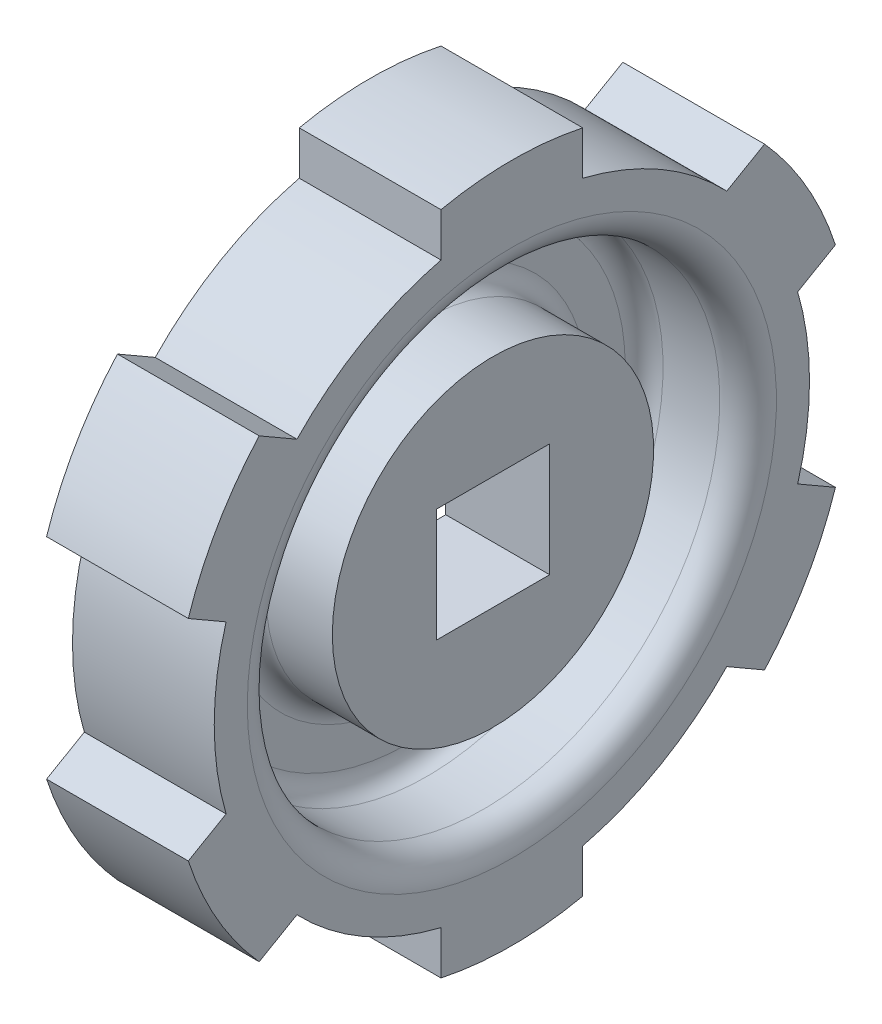
ISO-10303-21;
HEADER;
FILE_DESCRIPTION(('STEP AP214'),'2;1');
FILE_NAME('part.step','',(''),(''),'','','');
FILE_SCHEMA(('AUTOMOTIVE_DESIGN { 1 0 10303 214 1 1 1 1 }'));
ENDSEC;
DATA;
#1=APPLICATION_CONTEXT('core data for automotive mechanical design processes');
#2=APPLICATION_PROTOCOL_DEFINITION('international standard','automotive_design',2000,#1);
#3=PRODUCT_CONTEXT('',#1,'mechanical');
#4=PRODUCT('Part','Part','',(#3));
#5=PRODUCT_RELATED_PRODUCT_CATEGORY('part','',(#4));
#6=PRODUCT_DEFINITION_FORMATION('','',#4);
#7=PRODUCT_DEFINITION_CONTEXT('part definition',#1,'design');
#8=PRODUCT_DEFINITION('design','',#6,#7);
#9=PRODUCT_DEFINITION_SHAPE('','',#8);
#10=(LENGTH_UNIT() NAMED_UNIT(*) SI_UNIT(.MILLI.,.METRE.));
#11=(NAMED_UNIT(*) PLANE_ANGLE_UNIT() SI_UNIT($,.RADIAN.));
#12=(NAMED_UNIT(*) SI_UNIT($,.STERADIAN.) SOLID_ANGLE_UNIT());
#13=UNCERTAINTY_MEASURE_WITH_UNIT(LENGTH_MEASURE(1.E-05),#10,'distance_accuracy_value','');
#14=(GEOMETRIC_REPRESENTATION_CONTEXT(3) GLOBAL_UNCERTAINTY_ASSIGNED_CONTEXT((#13)) GLOBAL_UNIT_ASSIGNED_CONTEXT((#10,
#11,#12)) REPRESENTATION_CONTEXT('',''));
#15=CARTESIAN_POINT('',(0.,0.,0.));
#16=DIRECTION('',(0.,0.,1.));
#17=DIRECTION('',(1.,0.,0.));
#18=AXIS2_PLACEMENT_3D('',#15,#16,#17);
#19=CARTESIAN_POINT('',(0.,0.,0.));
#20=DIRECTION('',(-1.,0.,0.));
#21=DIRECTION('',(0.,0.,1.00000000000004));
#22=AXIS2_PLACEMENT_3D('',#19,#20,#21);
#23=CYLINDRICAL_SURFACE('',#22,31.5);
#24=CARTESIAN_POINT('',(15.,0.,0.));
#25=DIRECTION('',(-1.,0.,0.));
#26=DIRECTION('',(0.,0.,1.00000000000004));
#27=AXIS2_PLACEMENT_3D('',#24,#25,#26);
#28=CIRCLE('',#27,31.5);
#29=CARTESIAN_POINT('',(15.,21.7922490691625,22.7452825989839));
#30=VERTEX_POINT('',#29);
#31=CARTESIAN_POINT('',(15.,30.5941170815579,7.50000000000032));
#32=VERTEX_POINT('',#31);
#33=EDGE_CURVE('E309',#30,#32,#28,.T.);
#34=ORIENTED_EDGE('',*,*,#33,.T.);
#35=DIRECTION('',(-1.,0.,0.));
#36=VECTOR('',#35,1.);
#37=CARTESIAN_POINT('',(30.9443899264888,30.5941170815579,7.50000000000032));
#38=LINE('',#37,#36);
#39=CARTESIAN_POINT('',(0.,30.5941170815579,7.50000000000031));
#40=VERTEX_POINT('',#39);
#41=EDGE_CURVE('E268',#32,#40,#38,.T.);
#42=ORIENTED_EDGE('',*,*,#41,.T.);
#43=CARTESIAN_POINT('',(0.,0.,0.));
#44=DIRECTION('',(-1.,0.,0.));
#45=DIRECTION('',(0.,0.,1.00000000000004));
#46=AXIS2_PLACEMENT_3D('',#43,#44,#45);
#47=CIRCLE('',#46,31.5);
#48=CARTESIAN_POINT('',(0.,21.7922490691625,22.7452825989836));
#49=VERTEX_POINT('',#48);
#50=EDGE_CURVE('E258',#49,#40,#47,.T.);
#51=ORIENTED_EDGE('',*,*,#50,.F.);
#52=DIRECTION('',(-1.,0.,0.));
#53=VECTOR('',#52,1.);
#54=CARTESIAN_POINT('',(30.9443899264888,21.7922490691625,22.7452825989839));
#55=LINE('',#54,#53);
#56=EDGE_CURVE('E459',#30,#49,#55,.T.);
#57=ORIENTED_EDGE('',*,*,#56,.F.);
#58=EDGE_LOOP('',(#34,#42,#51,#57));
#59=FACE_BOUND('',#58,.T.);
#60=ADVANCED_FACE('F53',(#59),#23,.T.);
#61=CARTESIAN_POINT('',(30.9443899264888,-6.49519052838355,3.75000000000019));
#62=DIRECTION('',(0.,0.866025403784472,-0.50000000000003));
#63=DIRECTION('',(-1.,0.,0.));
#64=AXIS2_PLACEMENT_3D('',#61,#62,#63);
#65=PLANE('',#64);
#66=DIRECTION('',(-1.,0.,0.));
#67=VECTOR('',#66,1.);
#68=CARTESIAN_POINT('',(30.9443899264888,8.80186801239571,30.2452825989847));
#69=LINE('',#68,#67);
#70=CARTESIAN_POINT('',(15.,8.80186801239556,30.2452825989844));
#71=VERTEX_POINT('',#70);
#72=CARTESIAN_POINT('',(0.,8.80186801239573,30.2452825989844));
#73=VERTEX_POINT('',#72);
#74=EDGE_CURVE('E464',#71,#73,#69,.T.);
#75=ORIENTED_EDGE('',*,*,#74,.F.);
#76=DIRECTION('',(0.,0.50000000000003,0.866025403784472));
#77=VECTOR('',#76,1.);
#78=CARTESIAN_POINT('',(15.,-6.49519052838348,3.75000000000023));
#79=LINE('',#78,#77);
#80=CARTESIAN_POINT('',(15.,11.1098513630755,34.2428270253852));
#81=VERTEX_POINT('',#80);
#82=EDGE_CURVE('E466',#71,#81,#79,.T.);
#83=ORIENTED_EDGE('',*,*,#82,.T.);
#84=DIRECTION('',(-1.,0.,0.));
#85=VECTOR('',#84,1.);
#86=CARTESIAN_POINT('',(30.9443899264888,11.1098513630757,34.2428270253852));
#87=LINE('',#86,#85);
#88=CARTESIAN_POINT('',(0.,11.1098513630757,34.2428270253852));
#89=VERTEX_POINT('',#88);
#90=EDGE_CURVE('E453',#81,#89,#87,.T.);
#91=ORIENTED_EDGE('',*,*,#90,.T.);
#92=DIRECTION('',(0.,-0.50000000000003,-0.866025403784472));
#93=VECTOR('',#92,1.);
#94=CARTESIAN_POINT('',(0.,-6.49519052838355,3.75000000000023));
#95=LINE('',#94,#93);
#96=EDGE_CURVE('E469',#89,#73,#95,.T.);
#97=ORIENTED_EDGE('',*,*,#96,.T.);
#98=EDGE_LOOP('',(#75,#83,#91,#97));
#99=FACE_BOUND('',#98,.T.);
#100=ADVANCED_FACE('F516',(#99),#65,.F.);
#101=CARTESIAN_POINT('',(30.9443899264888,6.49519052838355,-3.75000000000027));
#102=DIRECTION('',(0.,0.866025403784472,-0.50000000000003));
#103=DIRECTION('',(-1.,0.,0.));
#104=AXIS2_PLACEMENT_3D('',#101,#102,#103);
#105=PLANE('',#104);
#106=DIRECTION('',(0.,0.50000000000003,0.866025403784472));
#107=VECTOR('',#106,1.);
#108=CARTESIAN_POINT('',(15.,6.49519052838363,-3.75000000000027));
#109=LINE('',#108,#107);
#110=CARTESIAN_POINT('',(15.,24.1002324198431,26.7428270253852));
#111=VERTEX_POINT('',#110);
#112=EDGE_CURVE('E456',#30,#111,#109,.T.);
#113=ORIENTED_EDGE('',*,*,#112,.F.);
#114=ORIENTED_EDGE('',*,*,#56,.T.);
#115=DIRECTION('',(0.,-0.50000000000003,-0.866025403784472));
#116=VECTOR('',#115,1.);
#117=CARTESIAN_POINT('',(0.,6.49519052838355,-3.75000000000023));
#118=LINE('',#117,#116);
#119=CARTESIAN_POINT('',(0.,24.1002324198431,26.7428270253849));
#120=VERTEX_POINT('',#119);
#121=EDGE_CURVE('E462',#120,#49,#118,.T.);
#122=ORIENTED_EDGE('',*,*,#121,.F.);
#123=DIRECTION('',(-1.,0.,0.));
#124=VECTOR('',#123,1.);
#125=CARTESIAN_POINT('',(30.9443899264888,24.1002324198431,26.7428270253852));
#126=LINE('',#125,#124);
#127=EDGE_CURVE('E448',#111,#120,#126,.T.);
#128=ORIENTED_EDGE('',*,*,#127,.F.);
#129=EDGE_LOOP('',(#113,#114,#122,#128));
#130=FACE_BOUND('',#129,.T.);
#131=ADVANCED_FACE('F524',(#130),#105,.T.);
#132=CARTESIAN_POINT('',(30.9443899264888,0.,0.));
#133=DIRECTION('',(-1.,0.,0.));
#134=DIRECTION('',(0.,-0.866025403784472,0.50000000000003));
#135=AXIS2_PLACEMENT_3D('',#132,#133,#134);
#136=CYLINDRICAL_SURFACE('',#135,36.);
#137=CARTESIAN_POINT('',(15.,0.,0.));
#138=DIRECTION('',(-1.,0.,0.));
#139=DIRECTION('',(0.,-0.866025403784472,0.50000000000003));
#140=AXIS2_PLACEMENT_3D('',#137,#138,#139);
#141=CIRCLE('',#140,36.);
#142=EDGE_CURVE('E446',#111,#81,#141,.F.);
#143=ORIENTED_EDGE('',*,*,#142,.F.);
#144=ORIENTED_EDGE('',*,*,#127,.T.);
#145=CARTESIAN_POINT('',(0.,0.,0.));
#146=DIRECTION('',(-1.,0.,0.));
#147=DIRECTION('',(0.,-0.866025403784472,0.50000000000003));
#148=AXIS2_PLACEMENT_3D('',#145,#146,#147);
#149=CIRCLE('',#148,36.);
#150=EDGE_CURVE('E450',#89,#120,#149,.T.);
#151=ORIENTED_EDGE('',*,*,#150,.F.);
#152=ORIENTED_EDGE('',*,*,#90,.F.);
#153=EDGE_LOOP('',(#143,#144,#151,#152));
#154=FACE_BOUND('',#153,.T.);
#155=ADVANCED_FACE('F530',(#154),#136,.T.);
#156=CARTESIAN_POINT('',(15.,-8.80186801239525,30.2452825989849));
#157=VERTEX_POINT('',#156);
#158=EDGE_CURVE('E75',#157,#71,#28,.T.);
#159=ORIENTED_EDGE('',*,*,#158,.T.);
#160=ORIENTED_EDGE('',*,*,#74,.T.);
#161=CARTESIAN_POINT('',(0.,-8.80186801239509,30.2452825989849));
#162=VERTEX_POINT('',#161);
#163=EDGE_CURVE('E68',#162,#73,#47,.T.);
#164=ORIENTED_EDGE('',*,*,#163,.F.);
#165=DIRECTION('',(-1.,0.,0.));
#166=VECTOR('',#165,1.);
#167=CARTESIAN_POINT('',(30.9443899264888,-8.80186801239509,30.2452825989846));
#168=LINE('',#167,#166);
#169=EDGE_CURVE('E432',#157,#162,#168,.T.);
#170=ORIENTED_EDGE('',*,*,#169,.F.);
#171=EDGE_LOOP('',(#159,#160,#164,#170));
#172=FACE_BOUND('',#171,.T.);
#173=ADVANCED_FACE('F519',(#172),#23,.T.);
#174=CARTESIAN_POINT('',(30.9443899264888,-6.49519052838363,-3.75000000000014));
#175=DIRECTION('',(0.,0.866025403784483,0.500000000000012));
#176=DIRECTION('',(-1.,0.,0.));
#177=AXIS2_PLACEMENT_3D('',#174,#175,#176);
#178=PLANE('',#177);
#179=DIRECTION('',(-1.,0.,0.));
#180=VECTOR('',#179,1.);
#181=CARTESIAN_POINT('',(30.9443899264888,-21.7922490691621,22.7452825989841));
#182=LINE('',#181,#180);
#183=CARTESIAN_POINT('',(15.,-21.7922490691621,22.7452825989844));
#184=VERTEX_POINT('',#183);
#185=CARTESIAN_POINT('',(0.,-21.7922490691621,22.7452825989844));
#186=VERTEX_POINT('',#185);
#187=EDGE_CURVE('E437',#184,#186,#182,.T.);
#188=ORIENTED_EDGE('',*,*,#187,.F.);
#189=DIRECTION('',(0.,-0.500000000000012,0.866025403784483));
#190=VECTOR('',#189,1.);
#191=CARTESIAN_POINT('',(15.,-6.49519052838356,-3.7500000000001));
#192=LINE('',#191,#190);
#193=CARTESIAN_POINT('',(15.,-24.1002324198425,26.7428270253857));
#194=VERTEX_POINT('',#193);
#195=EDGE_CURVE('E440',#184,#194,#192,.T.);
#196=ORIENTED_EDGE('',*,*,#195,.T.);
#197=DIRECTION('',(-1.,0.,0.));
#198=VECTOR('',#197,1.);
#199=CARTESIAN_POINT('',(30.9443899264888,-24.1002324198425,26.7428270253854));
#200=LINE('',#199,#198);
#201=CARTESIAN_POINT('',(0.,-24.1002324198425,26.7428270253857));
#202=VERTEX_POINT('',#201);
#203=EDGE_CURVE('E426',#194,#202,#200,.T.);
#204=ORIENTED_EDGE('',*,*,#203,.T.);
#205=DIRECTION('',(0.,0.500000000000012,-0.866025403784483));
#206=VECTOR('',#205,1.);
#207=CARTESIAN_POINT('',(0.,-6.49519052838363,-3.7500000000001));
#208=LINE('',#207,#206);
#209=EDGE_CURVE('E443',#202,#186,#208,.T.);
#210=ORIENTED_EDGE('',*,*,#209,.T.);
#211=EDGE_LOOP('',(#188,#196,#204,#210));
#212=FACE_BOUND('',#211,.T.);
#213=ADVANCED_FACE('F529',(#212),#178,.F.);
#214=CARTESIAN_POINT('',(30.9443899264888,6.49519052838363,3.75000000000006));
#215=DIRECTION('',(0.,0.866025403784483,0.500000000000012));
#216=DIRECTION('',(-1.,0.,0.));
#217=AXIS2_PLACEMENT_3D('',#214,#215,#216);
#218=PLANE('',#217);
#219=DIRECTION('',(0.,-0.500000000000012,0.866025403784483));
#220=VECTOR('',#219,1.);
#221=CARTESIAN_POINT('',(15.,6.49519052838371,3.75000000000006));
#222=LINE('',#221,#220);
#223=CARTESIAN_POINT('',(15.,-11.1098513630751,34.2428270253855));
#224=VERTEX_POINT('',#223);
#225=EDGE_CURVE('E429',#157,#224,#222,.T.);
#226=ORIENTED_EDGE('',*,*,#225,.F.);
#227=ORIENTED_EDGE('',*,*,#169,.T.);
#228=DIRECTION('',(0.,0.500000000000012,-0.866025403784483));
#229=VECTOR('',#228,1.);
#230=CARTESIAN_POINT('',(0.,6.49519052838363,3.75000000000009));
#231=LINE('',#230,#229);
#232=CARTESIAN_POINT('',(0.,-11.109851363075,34.2428270253855));
#233=VERTEX_POINT('',#232);
#234=EDGE_CURVE('E435',#233,#162,#231,.T.);
#235=ORIENTED_EDGE('',*,*,#234,.F.);
#236=DIRECTION('',(-1.,0.,0.));
#237=VECTOR('',#236,1.);
#238=CARTESIAN_POINT('',(30.9443899264888,-11.109851363075,34.2428270253855));
#239=LINE('',#238,#237);
#240=EDGE_CURVE('E421',#224,#233,#239,.T.);
#241=ORIENTED_EDGE('',*,*,#240,.F.);
#242=EDGE_LOOP('',(#226,#227,#235,#241));
#243=FACE_BOUND('',#242,.T.);
#244=ADVANCED_FACE('F584',(#243),#218,.T.);
#245=CARTESIAN_POINT('',(30.9443899264888,0.,0.));
#246=DIRECTION('',(-1.,0.,0.));
#247=DIRECTION('',(0.,-0.866025403784483,-0.500000000000012));
#248=AXIS2_PLACEMENT_3D('',#245,#246,#247);
#249=CYLINDRICAL_SURFACE('',#248,36.);
#250=CARTESIAN_POINT('',(15.,0.,0.));
#251=DIRECTION('',(-1.,0.,0.));
#252=DIRECTION('',(0.,-0.866025403784483,-0.500000000000012));
#253=AXIS2_PLACEMENT_3D('',#250,#251,#252);
#254=CIRCLE('',#253,36.);
#255=EDGE_CURVE('E419',#224,#194,#254,.F.);
#256=ORIENTED_EDGE('',*,*,#255,.F.);
#257=ORIENTED_EDGE('',*,*,#240,.T.);
#258=CARTESIAN_POINT('',(0.,0.,0.));
#259=DIRECTION('',(-1.,0.,0.));
#260=DIRECTION('',(0.,-0.866025403784483,-0.500000000000012));
#261=AXIS2_PLACEMENT_3D('',#258,#259,#260);
#262=CIRCLE('',#261,36.);
#263=EDGE_CURVE('E423',#202,#233,#262,.T.);
#264=ORIENTED_EDGE('',*,*,#263,.F.);
#265=ORIENTED_EDGE('',*,*,#203,.F.);
#266=EDGE_LOOP('',(#256,#257,#264,#265));
#267=FACE_BOUND('',#266,.T.);
#268=ADVANCED_FACE('F576',(#267),#249,.T.);
#269=CARTESIAN_POINT('',(15.,-30.5941170815579,7.50000000000031));
#270=VERTEX_POINT('',#269);
#271=EDGE_CURVE('E389',#270,#184,#28,.T.);
#272=ORIENTED_EDGE('',*,*,#271,.T.);
#273=ORIENTED_EDGE('',*,*,#187,.T.);
#274=CARTESIAN_POINT('',(0.,-30.5941170815579,7.50000000000031));
#275=VERTEX_POINT('',#274);
#276=EDGE_CURVE('E393',#275,#186,#47,.T.);
#277=ORIENTED_EDGE('',*,*,#276,.F.);
#278=DIRECTION('',(-1.,0.,0.));
#279=VECTOR('',#278,1.);
#280=CARTESIAN_POINT('',(30.9443899264888,-30.5941170815579,7.50000000000031));
#281=LINE('',#280,#279);
#282=EDGE_CURVE('E404',#270,#275,#281,.T.);
#283=ORIENTED_EDGE('',*,*,#282,.F.);
#284=EDGE_LOOP('',(#272,#273,#277,#283));
#285=FACE_BOUND('',#284,.T.);
#286=ADVANCED_FACE('F531',(#285),#23,.T.);
#287=CARTESIAN_POINT('',(30.9443899264888,0.,-7.50000000000031));
#288=DIRECTION('',(0.,0.,1.00000000000004));
#289=DIRECTION('',(-1.,0.,0.));
#290=AXIS2_PLACEMENT_3D('',#287,#288,#289);
#291=PLANE('',#290);
#292=DIRECTION('',(-1.,0.,0.));
#293=VECTOR('',#292,1.);
#294=CARTESIAN_POINT('',(30.9443899264888,-30.5941170815579,-7.50000000000032));
#295=LINE('',#294,#293);
#296=CARTESIAN_POINT('',(15.,-30.5941170815579,-7.50000000000032));
#297=VERTEX_POINT('',#296);
#298=CARTESIAN_POINT('',(0.,-30.5941170815579,-7.50000000000031));
#299=VERTEX_POINT('',#298);
#300=EDGE_CURVE('E410',#297,#299,#295,.T.);
#301=ORIENTED_EDGE('',*,*,#300,.F.);
#302=DIRECTION('',(0.,-1.00000000000004,0.));
#303=VECTOR('',#302,1.);
#304=CARTESIAN_POINT('',(15.,0.,-7.50000000000031));
#305=LINE('',#304,#303);
#306=CARTESIAN_POINT('',(15.,-35.2100837829177,-7.50000000000024));
#307=VERTEX_POINT('',#306);
#308=EDGE_CURVE('E413',#297,#307,#305,.T.);
#309=ORIENTED_EDGE('',*,*,#308,.T.);
#310=DIRECTION('',(-1.,0.,0.));
#311=VECTOR('',#310,1.);
#312=CARTESIAN_POINT('',(30.9443899264888,-35.2100837829177,-7.50000000000032));
#313=LINE('',#312,#311);
#314=CARTESIAN_POINT('',(0.,-35.2100837829177,-7.50000000000024));
#315=VERTEX_POINT('',#314);
#316=EDGE_CURVE('E398',#307,#315,#313,.T.);
#317=ORIENTED_EDGE('',*,*,#316,.T.);
#318=DIRECTION('',(0.,1.00000000000004,0.));
#319=VECTOR('',#318,1.);
#320=CARTESIAN_POINT('',(0.,0.,-7.50000000000031));
#321=LINE('',#320,#319);
#322=EDGE_CURVE('E416',#315,#299,#321,.T.);
#323=ORIENTED_EDGE('',*,*,#322,.T.);
#324=EDGE_LOOP('',(#301,#309,#317,#323));
#325=FACE_BOUND('',#324,.T.);
#326=ADVANCED_FACE('F575',(#325),#291,.F.);
#327=CARTESIAN_POINT('',(30.9443899264888,0.,7.50000000000031));
#328=DIRECTION('',(0.,0.,1.00000000000004));
#329=DIRECTION('',(-1.,0.,0.));
#330=AXIS2_PLACEMENT_3D('',#327,#328,#329);
#331=PLANE('',#330);
#332=DIRECTION('',(0.,-1.00000000000004,0.));
#333=VECTOR('',#332,1.);
#334=CARTESIAN_POINT('',(15.,0.,7.50000000000031));
#335=LINE('',#334,#333);
#336=CARTESIAN_POINT('',(15.,-35.2100837829177,7.50000000000038));
#337=VERTEX_POINT('',#336);
#338=EDGE_CURVE('E401',#270,#337,#335,.T.);
#339=ORIENTED_EDGE('',*,*,#338,.F.);
#340=ORIENTED_EDGE('',*,*,#282,.T.);
#341=DIRECTION('',(0.,1.00000000000004,0.));
#342=VECTOR('',#341,1.);
#343=CARTESIAN_POINT('',(0.,0.,7.50000000000031));
#344=LINE('',#343,#342);
#345=CARTESIAN_POINT('',(0.,-35.2100837829177,7.50000000000038));
#346=VERTEX_POINT('',#345);
#347=EDGE_CURVE('E407',#346,#275,#344,.T.);
#348=ORIENTED_EDGE('',*,*,#347,.F.);
#349=DIRECTION('',(-1.,0.,0.));
#350=VECTOR('',#349,1.);
#351=CARTESIAN_POINT('',(30.9443899264888,-35.2100837829177,7.5000000000003));
#352=LINE('',#351,#350);
#353=EDGE_CURVE('E392',#337,#346,#352,.T.);
#354=ORIENTED_EDGE('',*,*,#353,.F.);
#355=EDGE_LOOP('',(#339,#340,#348,#354));
#356=FACE_BOUND('',#355,.T.);
#357=ADVANCED_FACE('F571',(#356),#331,.T.);
#358=CARTESIAN_POINT('',(30.9443899264888,0.,0.));
#359=DIRECTION('',(-1.,0.,0.));
#360=DIRECTION('',(0.,0.,-1.00000000000004));
#361=AXIS2_PLACEMENT_3D('',#358,#359,#360);
#362=CYLINDRICAL_SURFACE('',#361,36.);
#363=CARTESIAN_POINT('',(15.,0.,0.));
#364=DIRECTION('',(-1.,0.,0.));
#365=DIRECTION('',(0.,0.,-1.00000000000004));
#366=AXIS2_PLACEMENT_3D('',#363,#364,#365);
#367=CIRCLE('',#366,36.);
#368=EDGE_CURVE('E390',#337,#307,#367,.F.);
#369=ORIENTED_EDGE('',*,*,#368,.F.);
#370=ORIENTED_EDGE('',*,*,#353,.T.);
#371=CARTESIAN_POINT('',(0.,0.,0.));
#372=DIRECTION('',(-1.,0.,0.));
#373=DIRECTION('',(0.,0.,-1.00000000000004));
#374=AXIS2_PLACEMENT_3D('',#371,#372,#373);
#375=CIRCLE('',#374,36.);
#376=EDGE_CURVE('E395',#315,#346,#375,.T.);
#377=ORIENTED_EDGE('',*,*,#376,.F.);
#378=ORIENTED_EDGE('',*,*,#316,.F.);
#379=EDGE_LOOP('',(#369,#370,#377,#378));
#380=FACE_BOUND('',#379,.T.);
#381=ADVANCED_FACE('F563',(#380),#362,.T.);
#382=CARTESIAN_POINT('',(15.,-21.7922490691624,-22.745282598984));
#383=VERTEX_POINT('',#382);
#384=EDGE_CURVE('E359',#383,#297,#28,.T.);
#385=ORIENTED_EDGE('',*,*,#384,.T.);
#386=ORIENTED_EDGE('',*,*,#300,.T.);
#387=CARTESIAN_POINT('',(0.,-21.7922490691624,-22.745282598984));
#388=VERTEX_POINT('',#387);
#389=EDGE_CURVE('E363',#388,#299,#47,.T.);
#390=ORIENTED_EDGE('',*,*,#389,.F.);
#391=DIRECTION('',(-1.,0.,0.));
#392=VECTOR('',#391,1.);
#393=CARTESIAN_POINT('',(30.9443899264888,-21.7922490691624,-22.7452825989843));
#394=LINE('',#393,#392);
#395=EDGE_CURVE('E374',#383,#388,#394,.T.);
#396=ORIENTED_EDGE('',*,*,#395,.F.);
#397=EDGE_LOOP('',(#385,#386,#390,#396));
#398=FACE_BOUND('',#397,.T.);
#399=ADVANCED_FACE('F551',(#398),#23,.T.);
#400=CARTESIAN_POINT('',(30.9443899264888,6.49519052838358,-3.75000000000022));
#401=DIRECTION('',(0.,-0.866025403784476,0.500000000000024));
#402=DIRECTION('',(-1.,0.,0.));
#403=AXIS2_PLACEMENT_3D('',#400,#401,#402);
#404=PLANE('',#403);
#405=DIRECTION('',(-1.,0.,0.));
#406=VECTOR('',#405,1.);
#407=CARTESIAN_POINT('',(30.9443899264888,-8.8018680123955,-30.245282598985));
#408=LINE('',#407,#406);
#409=CARTESIAN_POINT('',(15.,-8.80186801239566,-30.2452825989847));
#410=VERTEX_POINT('',#409);
#411=CARTESIAN_POINT('',(0.,-8.80186801239552,-30.2452825989847));
#412=VERTEX_POINT('',#411);
#413=EDGE_CURVE('E380',#410,#412,#408,.T.);
#414=ORIENTED_EDGE('',*,*,#413,.F.);
#415=DIRECTION('',(0.,-0.500000000000024,-0.866025403784476));
#416=VECTOR('',#415,1.);
#417=CARTESIAN_POINT('',(15.,6.49519052838366,-3.75000000000022));
#418=LINE('',#417,#416);
#419=CARTESIAN_POINT('',(15.,-11.1098513630756,-34.2428270253854));
#420=VERTEX_POINT('',#419);
#421=EDGE_CURVE('E383',#410,#420,#418,.T.);
#422=ORIENTED_EDGE('',*,*,#421,.T.);
#423=DIRECTION('',(-1.,0.,0.));
#424=VECTOR('',#423,1.);
#425=CARTESIAN_POINT('',(30.9443899264888,-11.1098513630754,-34.2428270253854));
#426=LINE('',#425,#424);
#427=CARTESIAN_POINT('',(0.,-11.1098513630754,-34.2428270253854));
#428=VERTEX_POINT('',#427);
#429=EDGE_CURVE('E368',#420,#428,#426,.T.);
#430=ORIENTED_EDGE('',*,*,#429,.T.);
#431=DIRECTION('',(0.,0.500000000000024,0.866025403784476));
#432=VECTOR('',#431,1.);
#433=CARTESIAN_POINT('',(0.,6.49519052838358,-3.75000000000019));
#434=LINE('',#433,#432);
#435=EDGE_CURVE('E386',#428,#412,#434,.T.);
#436=ORIENTED_EDGE('',*,*,#435,.T.);
#437=EDGE_LOOP('',(#414,#422,#430,#436));
#438=FACE_BOUND('',#437,.T.);
#439=ADVANCED_FACE('F562',(#438),#404,.F.);
#440=CARTESIAN_POINT('',(30.9443899264888,-6.49519052838358,3.75000000000014));
#441=DIRECTION('',(0.,-0.866025403784476,0.500000000000024));
#442=DIRECTION('',(-1.,0.,0.));
#443=AXIS2_PLACEMENT_3D('',#440,#441,#442);
#444=PLANE('',#443);
#445=DIRECTION('',(0.,-0.500000000000024,-0.866025403784476));
#446=VECTOR('',#445,1.);
#447=CARTESIAN_POINT('',(15.,-6.4951905283835,3.75000000000018));
#448=LINE('',#447,#446);
#449=CARTESIAN_POINT('',(15.,-24.1002324198429,-26.7428270253853));
#450=VERTEX_POINT('',#449);
#451=EDGE_CURVE('E371',#383,#450,#448,.T.);
#452=ORIENTED_EDGE('',*,*,#451,.F.);
#453=ORIENTED_EDGE('',*,*,#395,.T.);
#454=DIRECTION('',(0.,0.500000000000024,0.866025403784476));
#455=VECTOR('',#454,1.);
#456=CARTESIAN_POINT('',(0.,-6.49519052838358,3.75000000000018));
#457=LINE('',#456,#455);
#458=CARTESIAN_POINT('',(0.,-24.1002324198429,-26.7428270253853));
#459=VERTEX_POINT('',#458);
#460=EDGE_CURVE('E377',#459,#388,#457,.T.);
#461=ORIENTED_EDGE('',*,*,#460,.F.);
#462=DIRECTION('',(-1.,0.,0.));
#463=VECTOR('',#462,1.);
#464=CARTESIAN_POINT('',(30.9443899264888,-24.1002324198429,-26.7428270253856));
#465=LINE('',#464,#463);
#466=EDGE_CURVE('E362',#450,#459,#465,.T.);
#467=ORIENTED_EDGE('',*,*,#466,.F.);
#468=EDGE_LOOP('',(#452,#453,#461,#467));
#469=FACE_BOUND('',#468,.T.);
#470=ADVANCED_FACE('F558',(#469),#444,.T.);
#471=CARTESIAN_POINT('',(30.9443899264888,0.,0.));
#472=DIRECTION('',(-1.,0.,0.));
#473=DIRECTION('',(0.,0.866025403784476,-0.500000000000024));
#474=AXIS2_PLACEMENT_3D('',#471,#472,#473);
#475=CYLINDRICAL_SURFACE('',#474,36.);
#476=CARTESIAN_POINT('',(15.,0.,0.));
#477=DIRECTION('',(-1.,0.,0.));
#478=DIRECTION('',(0.,0.866025403784476,-0.500000000000024));
#479=AXIS2_PLACEMENT_3D('',#476,#477,#478);
#480=CIRCLE('',#479,36.);
#481=EDGE_CURVE('E360',#450,#420,#480,.F.);
#482=ORIENTED_EDGE('',*,*,#481,.F.);
#483=ORIENTED_EDGE('',*,*,#466,.T.);
#484=CARTESIAN_POINT('',(0.,0.,0.));
#485=DIRECTION('',(-1.,0.,0.));
#486=DIRECTION('',(0.,0.866025403784476,-0.500000000000024));
#487=AXIS2_PLACEMENT_3D('',#484,#485,#486);
#488=CIRCLE('',#487,36.);
#489=EDGE_CURVE('E365',#428,#459,#488,.T.);
#490=ORIENTED_EDGE('',*,*,#489,.F.);
#491=ORIENTED_EDGE('',*,*,#429,.F.);
#492=EDGE_LOOP('',(#482,#483,#490,#491));
#493=FACE_BOUND('',#492,.T.);
#494=ADVANCED_FACE('F549',(#493),#475,.T.);
#495=CARTESIAN_POINT('',(15.,8.80186801239515,-30.2452825989851));
#496=VERTEX_POINT('',#495);
#497=EDGE_CURVE('E310',#496,#410,#28,.T.);
#498=ORIENTED_EDGE('',*,*,#497,.T.);
#499=ORIENTED_EDGE('',*,*,#413,.T.);
#500=CARTESIAN_POINT('',(0.,8.80186801239531,-30.2452825989851));
#501=VERTEX_POINT('',#500);
#502=EDGE_CURVE('E313',#501,#412,#47,.T.);
#503=ORIENTED_EDGE('',*,*,#502,.F.);
#504=DIRECTION('',(-1.,0.,0.));
#505=VECTOR('',#504,1.);
#506=CARTESIAN_POINT('',(30.9443899264888,8.80186801239531,-30.2452825989848));
#507=LINE('',#506,#505);
#508=EDGE_CURVE('E344',#496,#501,#507,.T.);
#509=ORIENTED_EDGE('',*,*,#508,.F.);
#510=EDGE_LOOP('',(#498,#499,#503,#509));
#511=FACE_BOUND('',#510,.T.);
#512=ADVANCED_FACE('F536',(#511),#23,.T.);
#513=CARTESIAN_POINT('',(30.9443899264888,6.49519052838361,3.7500000000001));
#514=DIRECTION('',(0.,-0.866025403784479,-0.500000000000018));
#515=DIRECTION('',(-1.,0.,0.));
#516=AXIS2_PLACEMENT_3D('',#513,#514,#515);
#517=PLANE('',#516);
#518=DIRECTION('',(-1.,0.,0.));
#519=VECTOR('',#518,1.);
#520=CARTESIAN_POINT('',(30.9443899264888,21.7922490691622,-22.7452825989842));
#521=LINE('',#520,#519);
#522=CARTESIAN_POINT('',(15.,21.7922490691622,-22.7452825989842));
#523=VERTEX_POINT('',#522);
#524=CARTESIAN_POINT('',(0.,21.7922490691622,-22.7452825989845));
#525=VERTEX_POINT('',#524);
#526=EDGE_CURVE('E350',#523,#525,#521,.T.);
#527=ORIENTED_EDGE('',*,*,#526,.F.);
#528=DIRECTION('',(0.,0.500000000000018,-0.866025403784479));
#529=VECTOR('',#528,1.);
#530=CARTESIAN_POINT('',(15.,6.49519052838368,3.7500000000001));
#531=LINE('',#530,#529);
#532=CARTESIAN_POINT('',(15.,24.1002324198427,-26.7428270253854));
#533=VERTEX_POINT('',#532);
#534=EDGE_CURVE('E353',#523,#533,#531,.T.);
#535=ORIENTED_EDGE('',*,*,#534,.T.);
#536=DIRECTION('',(-1.,0.,0.));
#537=VECTOR('',#536,1.);
#538=CARTESIAN_POINT('',(30.9443899264888,24.1002324198427,-26.7428270253854));
#539=LINE('',#538,#537);
#540=CARTESIAN_POINT('',(0.,24.1002324198427,-26.7428270253858));
#541=VERTEX_POINT('',#540);
#542=EDGE_CURVE('E338',#533,#541,#539,.T.);
#543=ORIENTED_EDGE('',*,*,#542,.T.);
#544=DIRECTION('',(0.,-0.500000000000018,0.866025403784479));
#545=VECTOR('',#544,1.);
#546=CARTESIAN_POINT('',(0.,6.49519052838361,3.75000000000014));
#547=LINE('',#546,#545);
#548=EDGE_CURVE('E356',#541,#525,#547,.T.);
#549=ORIENTED_EDGE('',*,*,#548,.T.);
#550=EDGE_LOOP('',(#527,#535,#543,#549));
#551=FACE_BOUND('',#550,.T.);
#552=ADVANCED_FACE('F548',(#551),#517,.F.);
#553=CARTESIAN_POINT('',(30.9443899264888,-6.49519052838361,-3.75000000000018));
#554=DIRECTION('',(0.,-0.866025403784479,-0.500000000000018));
#555=DIRECTION('',(-1.,0.,0.));
#556=AXIS2_PLACEMENT_3D('',#553,#554,#555);
#557=PLANE('',#556);
#558=DIRECTION('',(0.,0.500000000000018,-0.866025403784479));
#559=VECTOR('',#558,1.);
#560=CARTESIAN_POINT('',(15.,-6.49519052838353,-3.75000000000014));
#561=LINE('',#560,#559);
#562=CARTESIAN_POINT('',(15.,11.109851363075,-34.2428270253855));
#563=VERTEX_POINT('',#562);
#564=EDGE_CURVE('E341',#496,#563,#561,.T.);
#565=ORIENTED_EDGE('',*,*,#564,.F.);
#566=ORIENTED_EDGE('',*,*,#508,.T.);
#567=DIRECTION('',(0.,-0.500000000000018,0.866025403784479));
#568=VECTOR('',#567,1.);
#569=CARTESIAN_POINT('',(0.,-6.49519052838361,-3.75000000000014));
#570=LINE('',#569,#568);
#571=CARTESIAN_POINT('',(0.,11.1098513630752,-34.2428270253855));
#572=VERTEX_POINT('',#571);
#573=EDGE_CURVE('E347',#572,#501,#570,.T.);
#574=ORIENTED_EDGE('',*,*,#573,.F.);
#575=DIRECTION('',(-1.,0.,0.));
#576=VECTOR('',#575,1.);
#577=CARTESIAN_POINT('',(30.9443899264888,11.1098513630752,-34.2428270253855));
#578=LINE('',#577,#576);
#579=EDGE_CURVE('E333',#563,#572,#578,.T.);
#580=ORIENTED_EDGE('',*,*,#579,.F.);
#581=EDGE_LOOP('',(#565,#566,#574,#580));
#582=FACE_BOUND('',#581,.T.);
#583=ADVANCED_FACE('F544',(#582),#557,.T.);
#584=CARTESIAN_POINT('',(30.9443899264888,0.,0.));
#585=DIRECTION('',(-1.,0.,0.));
#586=DIRECTION('',(0.,0.866025403784479,0.500000000000018));
#587=AXIS2_PLACEMENT_3D('',#584,#585,#586);
#588=CYLINDRICAL_SURFACE('',#587,36.);
#589=CARTESIAN_POINT('',(15.,0.,0.));
#590=DIRECTION('',(-1.,0.,0.));
#591=DIRECTION('',(0.,0.866025403784479,0.500000000000018));
#592=AXIS2_PLACEMENT_3D('',#589,#590,#591);
#593=CIRCLE('',#592,36.);
#594=EDGE_CURVE('E331',#563,#533,#593,.F.);
#595=ORIENTED_EDGE('',*,*,#594,.F.);
#596=ORIENTED_EDGE('',*,*,#579,.T.);
#597=CARTESIAN_POINT('',(0.,0.,0.));
#598=DIRECTION('',(-1.,0.,0.));
#599=DIRECTION('',(0.,0.866025403784479,0.500000000000018));
#600=AXIS2_PLACEMENT_3D('',#597,#598,#599);
#601=CIRCLE('',#600,36.);
#602=EDGE_CURVE('E335',#541,#572,#601,.T.);
#603=ORIENTED_EDGE('',*,*,#602,.F.);
#604=ORIENTED_EDGE('',*,*,#542,.F.);
#605=EDGE_LOOP('',(#595,#596,#603,#604));
#606=FACE_BOUND('',#605,.T.);
#607=ADVANCED_FACE('F534',(#606),#588,.T.);
#608=CARTESIAN_POINT('',(15.,30.5941170815579,-7.50000000000031));
#609=VERTEX_POINT('',#608);
#610=EDGE_CURVE('E306',#609,#523,#28,.T.);
#611=ORIENTED_EDGE('',*,*,#610,.T.);
#612=ORIENTED_EDGE('',*,*,#526,.T.);
#613=CARTESIAN_POINT('',(0.,30.5941170815579,-7.50000000000031));
#614=VERTEX_POINT('',#613);
#615=EDGE_CURVE('E308',#614,#525,#47,.T.);
#616=ORIENTED_EDGE('',*,*,#615,.F.);
#617=DIRECTION('',(-1.,0.,0.));
#618=VECTOR('',#617,1.);
#619=CARTESIAN_POINT('',(30.9443899264888,30.5941170815579,-7.50000000000031));
#620=LINE('',#619,#618);
#621=EDGE_CURVE('E271',#609,#614,#620,.T.);
#622=ORIENTED_EDGE('',*,*,#621,.F.);
#623=EDGE_LOOP('',(#611,#612,#616,#622));
#624=FACE_BOUND('',#623,.T.);
#625=ADVANCED_FACE('F520',(#624),#23,.T.);
#626=CARTESIAN_POINT('',(2.,0.,0.));
#627=DIRECTION('',(1.,0.,0.));
#628=DIRECTION('',(0.,0.,-1.00000000000004));
#629=AXIS2_PLACEMENT_3D('',#626,#627,#628);
#630=PLANE('',#629);
#631=DIRECTION('',(0.,0.,-1.00000000000004));
#632=VECTOR('',#631,1.);
#633=CARTESIAN_POINT('',(2.,6.00000000000031,-6.00000000000031));
#634=LINE('',#633,#632);
#635=CARTESIAN_POINT('',(2.,6.00000000000031,6.00000000000031));
#636=VERTEX_POINT('',#635);
#637=CARTESIAN_POINT('',(2.,6.00000000000031,-6.00000000000031));
#638=VERTEX_POINT('',#637);
#639=EDGE_CURVE('E279',#636,#638,#634,.T.);
#640=ORIENTED_EDGE('',*,*,#639,.F.);
#641=DIRECTION('',(0.,1.00000000000004,0.));
#642=VECTOR('',#641,1.);
#643=CARTESIAN_POINT('',(2.,-6.00000000000031,6.00000000000038));
#644=LINE('',#643,#642);
#645=CARTESIAN_POINT('',(2.,-6.00000000000031,6.00000000000038));
#646=VERTEX_POINT('',#645);
#647=EDGE_CURVE('E277',#646,#636,#644,.T.);
#648=ORIENTED_EDGE('',*,*,#647,.F.);
#649=DIRECTION('',(0.,0.,1.00000000000004));
#650=VECTOR('',#649,1.);
#651=CARTESIAN_POINT('',(2.,-6.00000000000031,-6.00000000000024));
#652=LINE('',#651,#650);
#653=CARTESIAN_POINT('',(2.,-6.00000000000031,-6.00000000000024));
#654=VERTEX_POINT('',#653);
#655=EDGE_CURVE('E285',#654,#646,#652,.T.);
#656=ORIENTED_EDGE('',*,*,#655,.F.);
#657=DIRECTION('',(0.,-1.00000000000004,0.));
#658=VECTOR('',#657,1.);
#659=CARTESIAN_POINT('',(2.,-6.00000000000031,-6.00000000000024));
#660=LINE('',#659,#658);
#661=EDGE_CURVE('E282',#638,#654,#660,.T.);
#662=ORIENTED_EDGE('',*,*,#661,.F.);
#663=EDGE_LOOP('',(#640,#648,#656,#662));
#664=FACE_BOUND('',#663,.T.);
#665=CARTESIAN_POINT('',(2.,0.,0.));
#666=DIRECTION('',(-1.,0.,0.));
#667=DIRECTION('',(0.,0.,1.00000000000004));
#668=AXIS2_PLACEMENT_3D('',#665,#666,#667);
#669=CIRCLE('',#668,15.);
#670=CARTESIAN_POINT('',(1.99999999999999,0.,15.0000000000006));
#671=VERTEX_POINT('',#670);
#672=EDGE_CURVE('E316',#671,#671,#669,.T.);
#673=ORIENTED_EDGE('',*,*,#672,.T.);
#674=EDGE_LOOP('',(#673));
#675=FACE_BOUND('',#674,.T.);
#676=ADVANCED_FACE('F533',(#664,#675),#630,.F.);
#677=CARTESIAN_POINT('',(0.,0.,0.));
#678=DIRECTION('',(-1.,0.,0.));
#679=DIRECTION('',(0.,0.,1.00000000000004));
#680=AXIS2_PLACEMENT_3D('',#677,#678,#679);
#681=CYLINDRICAL_SURFACE('',#680,15.);
#682=ORIENTED_EDGE('',*,*,#672,.F.);
#683=EDGE_LOOP('',(#682));
#684=FACE_BOUND('',#683,.T.);
#685=CARTESIAN_POINT('',(0.,0.,0.));
#686=DIRECTION('',(-1.,0.,0.));
#687=DIRECTION('',(0.,0.,1.00000000000004));
#688=AXIS2_PLACEMENT_3D('',#685,#686,#687);
#689=CIRCLE('',#688,15.);
#690=CARTESIAN_POINT('',(0.,0.,15.0000000000006));
#691=VERTEX_POINT('',#690);
#692=EDGE_CURVE('E312',#691,#691,#689,.T.);
#693=ORIENTED_EDGE('',*,*,#692,.T.);
#694=EDGE_LOOP('',(#693));
#695=FACE_BOUND('',#694,.T.);
#696=ADVANCED_FACE('F541',(#684,#695),#681,.F.);
#697=CARTESIAN_POINT('',(0.,15.0000000000006,0.));
#698=DIRECTION('',(1.,0.,0.));
#699=DIRECTION('',(0.,0.,-1.00000000000004));
#700=AXIS2_PLACEMENT_3D('',#697,#698,#699);
#701=PLANE('',#700);
#702=ORIENTED_EDGE('',*,*,#692,.F.);
#703=EDGE_LOOP('',(#702));
#704=FACE_BOUND('',#703,.T.);
#705=ORIENTED_EDGE('',*,*,#163,.T.);
#706=ORIENTED_EDGE('',*,*,#96,.F.);
#707=ORIENTED_EDGE('',*,*,#150,.T.);
#708=ORIENTED_EDGE('',*,*,#121,.T.);
#709=ORIENTED_EDGE('',*,*,#50,.T.);
#710=DIRECTION('',(0.,-1.00000000000004,0.));
#711=VECTOR('',#710,1.);
#712=CARTESIAN_POINT('',(0.,0.,7.50000000000031));
#713=LINE('',#712,#711);
#714=CARTESIAN_POINT('',(0.,35.2100837829177,7.50000000000031));
#715=VERTEX_POINT('',#714);
#716=EDGE_CURVE('E244',#715,#40,#713,.T.);
#717=ORIENTED_EDGE('',*,*,#716,.F.);
#718=CARTESIAN_POINT('',(0.,0.,0.));
#719=DIRECTION('',(-1.,0.,0.));
#720=DIRECTION('',(0.,0.,1.00000000000004));
#721=AXIS2_PLACEMENT_3D('',#718,#719,#720);
#722=CIRCLE('',#721,36.);
#723=CARTESIAN_POINT('',(0.,35.2100837829177,-7.50000000000031));
#724=VERTEX_POINT('',#723);
#725=EDGE_CURVE('E256',#715,#724,#722,.T.);
#726=ORIENTED_EDGE('',*,*,#725,.T.);
#727=DIRECTION('',(0.,-1.00000000000004,0.));
#728=VECTOR('',#727,1.);
#729=CARTESIAN_POINT('',(0.,0.,-7.50000000000031));
#730=LINE('',#729,#728);
#731=EDGE_CURVE('E251',#724,#614,#730,.T.);
#732=ORIENTED_EDGE('',*,*,#731,.T.);
#733=ORIENTED_EDGE('',*,*,#615,.T.);
#734=ORIENTED_EDGE('',*,*,#548,.F.);
#735=ORIENTED_EDGE('',*,*,#602,.T.);
#736=ORIENTED_EDGE('',*,*,#573,.T.);
#737=ORIENTED_EDGE('',*,*,#502,.T.);
#738=ORIENTED_EDGE('',*,*,#435,.F.);
#739=ORIENTED_EDGE('',*,*,#489,.T.);
#740=ORIENTED_EDGE('',*,*,#460,.T.);
#741=ORIENTED_EDGE('',*,*,#389,.T.);
#742=ORIENTED_EDGE('',*,*,#322,.F.);
#743=ORIENTED_EDGE('',*,*,#376,.T.);
#744=ORIENTED_EDGE('',*,*,#347,.T.);
#745=ORIENTED_EDGE('',*,*,#276,.T.);
#746=ORIENTED_EDGE('',*,*,#209,.F.);
#747=ORIENTED_EDGE('',*,*,#263,.T.);
#748=ORIENTED_EDGE('',*,*,#234,.T.);
#749=EDGE_LOOP('',(#705,#706,#707,#708,#709,#717,#726,#732,#733,#734,#735,#736,#737,#738,#739,
#740,#741,#742,#743,#744,#745,#746,#747,#748));
#750=FACE_BOUND('',#749,.T.);
#751=ADVANCED_FACE('F254',(#704,#750),#701,.F.);
#752=CARTESIAN_POINT('',(15.,31.5000000000012,0.));
#753=DIRECTION('',(-1.,0.,0.));
#754=DIRECTION('',(0.,0.,1.00000000000004));
#755=AXIS2_PLACEMENT_3D('',#752,#753,#754);
#756=PLANE('',#755);
#757=ORIENTED_EDGE('',*,*,#158,.F.);
#758=ORIENTED_EDGE('',*,*,#225,.T.);
#759=ORIENTED_EDGE('',*,*,#255,.T.);
#760=ORIENTED_EDGE('',*,*,#195,.F.);
#761=ORIENTED_EDGE('',*,*,#271,.F.);
#762=ORIENTED_EDGE('',*,*,#338,.T.);
#763=ORIENTED_EDGE('',*,*,#368,.T.);
#764=ORIENTED_EDGE('',*,*,#308,.F.);
#765=ORIENTED_EDGE('',*,*,#384,.F.);
#766=ORIENTED_EDGE('',*,*,#451,.T.);
#767=ORIENTED_EDGE('',*,*,#481,.T.);
#768=ORIENTED_EDGE('',*,*,#421,.F.);
#769=ORIENTED_EDGE('',*,*,#497,.F.);
#770=ORIENTED_EDGE('',*,*,#564,.T.);
#771=ORIENTED_EDGE('',*,*,#594,.T.);
#772=ORIENTED_EDGE('',*,*,#534,.F.);
#773=ORIENTED_EDGE('',*,*,#610,.F.);
#774=DIRECTION('',(0.,1.00000000000004,0.));
#775=VECTOR('',#774,1.);
#776=CARTESIAN_POINT('',(15.,0.,-7.50000000000031));
#777=LINE('',#776,#775);
#778=CARTESIAN_POINT('',(15.,35.2100837829177,-7.50000000000031));
#779=VERTEX_POINT('',#778);
#780=EDGE_CURVE('E270',#609,#779,#777,.T.);
#781=ORIENTED_EDGE('',*,*,#780,.T.);
#782=CARTESIAN_POINT('',(15.,0.,0.));
#783=DIRECTION('',(-1.,0.,0.));
#784=DIRECTION('',(0.,0.,1.00000000000004));
#785=AXIS2_PLACEMENT_3D('',#782,#783,#784);
#786=CIRCLE('',#785,36.);
#787=CARTESIAN_POINT('',(15.,35.2100837829177,7.50000000000031));
#788=VERTEX_POINT('',#787);
#789=EDGE_CURVE('E275',#779,#788,#786,.F.);
#790=ORIENTED_EDGE('',*,*,#789,.T.);
#791=DIRECTION('',(0.,1.00000000000004,0.));
#792=VECTOR('',#791,1.);
#793=CARTESIAN_POINT('',(15.,0.,7.50000000000031));
#794=LINE('',#793,#792);
#795=EDGE_CURVE('E246',#32,#788,#794,.T.);
#796=ORIENTED_EDGE('',*,*,#795,.F.);
#797=ORIENTED_EDGE('',*,*,#33,.F.);
#798=ORIENTED_EDGE('',*,*,#112,.T.);
#799=ORIENTED_EDGE('',*,*,#142,.T.);
#800=ORIENTED_EDGE('',*,*,#82,.F.);
#801=EDGE_LOOP('',(#757,#758,#759,#760,#761,#762,#763,#764,#765,#766,#767,#768,#769,#770,#771,
#772,#773,#781,#790,#796,#797,#798,#799,#800));
#802=FACE_BOUND('',#801,.T.);
#803=CARTESIAN_POINT('',(15.,0.,0.));
#804=DIRECTION('',(-1.,0.,0.));
#805=DIRECTION('',(0.,0.,1.00000000000004));
#806=AXIS2_PLACEMENT_3D('',#803,#804,#805);
#807=CIRCLE('',#806,28.);
#808=CARTESIAN_POINT('',(15.,0.,28.0000000000011));
#809=VERTEX_POINT('',#808);
#810=EDGE_CURVE('E303',#809,#809,#807,.T.);
#811=ORIENTED_EDGE('',*,*,#810,.T.);
#812=EDGE_LOOP('',(#811));
#813=FACE_BOUND('',#812,.T.);
#814=ADVANCED_FACE('F506',(#802,#813),#756,.F.);
#815=CARTESIAN_POINT('',(12.,0.,0.));
#816=DIRECTION('',(-1.,0.,0.));
#817=DIRECTION('',(0.,0.,1.00000000000004));
#818=AXIS2_PLACEMENT_3D('',#815,#816,#817);
#819=TOROIDAL_SURFACE('',#818,28.,3.);
#820=ORIENTED_EDGE('',*,*,#810,.F.);
#821=EDGE_LOOP('',(#820));
#822=FACE_BOUND('',#821,.T.);
#823=CARTESIAN_POINT('',(12.,0.,0.));
#824=DIRECTION('',(-1.,0.,0.));
#825=DIRECTION('',(0.,0.,1.00000000000004));
#826=AXIS2_PLACEMENT_3D('',#823,#824,#825);
#827=CIRCLE('',#826,25.);
#828=CARTESIAN_POINT('',(12.,0.,25.000000000001));
#829=VERTEX_POINT('',#828);
#830=EDGE_CURVE('E300',#829,#829,#827,.T.);
#831=ORIENTED_EDGE('',*,*,#830,.T.);
#832=EDGE_LOOP('',(#831));
#833=FACE_BOUND('',#832,.T.);
#834=ADVANCED_FACE('F501',(#822,#833),#819,.T.);
#835=CARTESIAN_POINT('',(0.,0.,0.));
#836=DIRECTION('',(-1.,0.,0.));
#837=DIRECTION('',(0.,0.,1.00000000000004));
#838=AXIS2_PLACEMENT_3D('',#835,#836,#837);
#839=CYLINDRICAL_SURFACE('',#838,25.);
#840=CARTESIAN_POINT('',(6.,0.,0.));
#841=DIRECTION('',(-1.,0.,0.));
#842=DIRECTION('',(0.,0.,1.00000000000004));
#843=AXIS2_PLACEMENT_3D('',#840,#841,#842);
#844=CIRCLE('',#843,25.);
#845=CARTESIAN_POINT('',(5.99999999999998,0.,25.000000000001));
#846=VERTEX_POINT('',#845);
#847=EDGE_CURVE('E13',#846,#846,#844,.T.);
#848=ORIENTED_EDGE('',*,*,#847,.T.);
#849=EDGE_LOOP('',(#848));
#850=FACE_BOUND('',#849,.T.);
#851=ORIENTED_EDGE('',*,*,#830,.F.);
#852=EDGE_LOOP('',(#851));
#853=FACE_BOUND('',#852,.T.);
#854=ADVANCED_FACE('F491',(#850,#853),#839,.F.);
#855=CARTESIAN_POINT('',(4.,25.0000000000012,0.));
#856=DIRECTION('',(-1.,0.,0.));
#857=DIRECTION('',(0.,0.,1.00000000000004));
#858=AXIS2_PLACEMENT_3D('',#855,#856,#857);
#859=PLANE('',#858);
#860=CARTESIAN_POINT('',(4.,0.,0.));
#861=DIRECTION('',(-1.,0.,0.));
#862=DIRECTION('',(0.,0.,1.00000000000004));
#863=AXIS2_PLACEMENT_3D('',#860,#861,#862);
#864=CIRCLE('',#863,19.);
#865=CARTESIAN_POINT('',(3.99999999999999,0.,19.0000000000007));
#866=VERTEX_POINT('',#865);
#867=EDGE_CURVE('E475',#866,#866,#864,.T.);
#868=ORIENTED_EDGE('',*,*,#867,.T.);
#869=EDGE_LOOP('',(#868));
#870=FACE_BOUND('',#869,.T.);
#871=CARTESIAN_POINT('',(4.,0.,0.));
#872=DIRECTION('',(-1.,0.,0.));
#873=DIRECTION('',(0.,0.,1.00000000000004));
#874=AXIS2_PLACEMENT_3D('',#871,#872,#873);
#875=CIRCLE('',#874,23.);
#876=CARTESIAN_POINT('',(3.99999999999998,0.,23.0000000000009));
#877=VERTEX_POINT('',#876);
#878=EDGE_CURVE('E472',#877,#877,#875,.F.);
#879=ORIENTED_EDGE('',*,*,#878,.T.);
#880=EDGE_LOOP('',(#879));
#881=FACE_BOUND('',#880,.T.);
#882=ADVANCED_FACE('F488',(#870,#881),#859,.F.);
#883=CARTESIAN_POINT('',(0.,0.,0.));
#884=DIRECTION('',(-1.,0.,0.));
#885=DIRECTION('',(0.,0.,1.00000000000004));
#886=AXIS2_PLACEMENT_3D('',#883,#884,#885);
#887=CYLINDRICAL_SURFACE('',#886,17.);
#888=CARTESIAN_POINT('',(6.,0.,0.));
#889=DIRECTION('',(-1.,0.,0.));
#890=DIRECTION('',(0.,0.,1.00000000000004));
#891=AXIS2_PLACEMENT_3D('',#888,#889,#890);
#892=CIRCLE('',#891,17.);
#893=CARTESIAN_POINT('',(5.99999999999999,0.,17.0000000000007));
#894=VERTEX_POINT('',#893);
#895=EDGE_CURVE('E61',#894,#894,#892,.F.);
#896=ORIENTED_EDGE('',*,*,#895,.T.);
#897=EDGE_LOOP('',(#896));
#898=FACE_BOUND('',#897,.T.);
#899=CARTESIAN_POINT('',(13.,0.,0.));
#900=DIRECTION('',(-1.,0.,0.));
#901=DIRECTION('',(0.,0.,1.00000000000004));
#902=AXIS2_PLACEMENT_3D('',#899,#900,#901);
#903=CIRCLE('',#902,17.);
#904=CARTESIAN_POINT('',(13.,0.,17.0000000000007));
#905=VERTEX_POINT('',#904);
#906=EDGE_CURVE('E291',#905,#905,#903,.T.);
#907=ORIENTED_EDGE('',*,*,#906,.T.);
#908=EDGE_LOOP('',(#907));
#909=FACE_BOUND('',#908,.T.);
#910=ADVANCED_FACE('F480',(#898,#909),#887,.T.);
#911=CARTESIAN_POINT('',(13.,17.0000000000006,0.));
#912=DIRECTION('',(-1.,0.,0.));
#913=DIRECTION('',(0.,0.,1.00000000000004));
#914=AXIS2_PLACEMENT_3D('',#911,#912,#913);
#915=PLANE('',#914);
#916=DIRECTION('',(0.,0.,1.00000000000004));
#917=VECTOR('',#916,1.);
#918=CARTESIAN_POINT('',(13.,-6.00000000000023,0.));
#919=LINE('',#918,#917);
#920=CARTESIAN_POINT('',(13.,-6.00000000000023,-6.00000000000031));
#921=VERTEX_POINT('',#920);
#922=CARTESIAN_POINT('',(13.,-6.00000000000023,6.00000000000031));
#923=VERTEX_POINT('',#922);
#924=EDGE_CURVE('E325',#921,#923,#919,.T.);
#925=ORIENTED_EDGE('',*,*,#924,.T.);
#926=DIRECTION('',(0.,1.00000000000004,0.));
#927=VECTOR('',#926,1.);
#928=CARTESIAN_POINT('',(13.,17.0000000000006,6.00000000000031));
#929=LINE('',#928,#927);
#930=CARTESIAN_POINT('',(13.,6.00000000000039,6.00000000000031));
#931=VERTEX_POINT('',#930);
#932=EDGE_CURVE('E328',#923,#931,#929,.T.);
#933=ORIENTED_EDGE('',*,*,#932,.T.);
#934=DIRECTION('',(0.,0.,-1.00000000000004));
#935=VECTOR('',#934,1.);
#936=CARTESIAN_POINT('',(13.,6.00000000000039,0.));
#937=LINE('',#936,#935);
#938=CARTESIAN_POINT('',(13.,6.00000000000039,-6.00000000000031));
#939=VERTEX_POINT('',#938);
#940=EDGE_CURVE('E319',#931,#939,#937,.T.);
#941=ORIENTED_EDGE('',*,*,#940,.T.);
#942=DIRECTION('',(0.,-1.00000000000004,0.));
#943=VECTOR('',#942,1.);
#944=CARTESIAN_POINT('',(13.,17.0000000000006,-6.00000000000031));
#945=LINE('',#944,#943);
#946=EDGE_CURVE('E322',#939,#921,#945,.T.);
#947=ORIENTED_EDGE('',*,*,#946,.T.);
#948=EDGE_LOOP('',(#925,#933,#941,#947));
#949=FACE_BOUND('',#948,.T.);
#950=ORIENTED_EDGE('',*,*,#906,.F.);
#951=EDGE_LOOP('',(#950));
#952=FACE_BOUND('',#951,.T.);
#953=ADVANCED_FACE('F769',(#949,#952),#915,.F.);
#954=CARTESIAN_POINT('',(15.,-6.00000000000023,6.00000000000031));
#955=DIRECTION('',(0.,0.,1.00000000000004));
#956=DIRECTION('',(1.,0.,0.));
#957=AXIS2_PLACEMENT_3D('',#954,#955,#956);
#958=PLANE('',#957);
#959=DIRECTION('',(-1.,0.,0.));
#960=VECTOR('',#959,1.);
#961=CARTESIAN_POINT('',(15.,-6.00000000000023,6.00000000000031));
#962=LINE('',#961,#960);
#963=EDGE_CURVE('E289',#923,#646,#962,.T.);
#964=ORIENTED_EDGE('',*,*,#963,.T.);
#965=ORIENTED_EDGE('',*,*,#647,.T.);
#966=DIRECTION('',(-1.,0.,0.));
#967=VECTOR('',#966,1.);
#968=CARTESIAN_POINT('',(15.,6.00000000000039,6.00000000000031));
#969=LINE('',#968,#967);
#970=EDGE_CURVE('E288',#931,#636,#969,.T.);
#971=ORIENTED_EDGE('',*,*,#970,.F.);
#972=ORIENTED_EDGE('',*,*,#932,.F.);
#973=EDGE_LOOP('',(#964,#965,#971,#972));
#974=FACE_BOUND('',#973,.T.);
#975=ADVANCED_FACE('F761',(#974),#958,.F.);
#976=CARTESIAN_POINT('',(15.,-6.00000000000023,-6.00000000000031));
#977=DIRECTION('',(0.,-1.00000000000004,0.));
#978=DIRECTION('',(0.,0.,-1.00000000000004));
#979=AXIS2_PLACEMENT_3D('',#976,#977,#978);
#980=PLANE('',#979);
#981=DIRECTION('',(-1.,0.,0.));
#982=VECTOR('',#981,1.);
#983=CARTESIAN_POINT('',(15.,-6.00000000000023,-6.00000000000031));
#984=LINE('',#983,#982);
#985=EDGE_CURVE('E292',#921,#654,#984,.T.);
#986=ORIENTED_EDGE('',*,*,#985,.T.);
#987=ORIENTED_EDGE('',*,*,#655,.T.);
#988=ORIENTED_EDGE('',*,*,#963,.F.);
#989=ORIENTED_EDGE('',*,*,#924,.F.);
#990=EDGE_LOOP('',(#986,#987,#988,#989));
#991=FACE_BOUND('',#990,.T.);
#992=ADVANCED_FACE('F753',(#991),#980,.F.);
#993=CARTESIAN_POINT('',(15.,-6.00000000000023,-6.00000000000031));
#994=DIRECTION('',(0.,0.,-1.00000000000004));
#995=DIRECTION('',(-1.,0.,0.));
#996=AXIS2_PLACEMENT_3D('',#993,#994,#995);
#997=PLANE('',#996);
#998=DIRECTION('',(-1.,0.,0.));
#999=VECTOR('',#998,1.);
#1000=CARTESIAN_POINT('',(15.,6.00000000000039,-6.00000000000031));
#1001=LINE('',#1000,#999);
#1002=EDGE_CURVE('E294',#939,#638,#1001,.T.);
#1003=ORIENTED_EDGE('',*,*,#1002,.T.);
#1004=ORIENTED_EDGE('',*,*,#661,.T.);
#1005=ORIENTED_EDGE('',*,*,#985,.F.);
#1006=ORIENTED_EDGE('',*,*,#946,.F.);
#1007=EDGE_LOOP('',(#1003,#1004,#1005,#1006));
#1008=FACE_BOUND('',#1007,.T.);
#1009=ADVANCED_FACE('F745',(#1008),#997,.F.);
#1010=CARTESIAN_POINT('',(15.,6.00000000000039,-6.00000000000031));
#1011=DIRECTION('',(0.,1.00000000000004,0.));
#1012=DIRECTION('',(0.,0.,1.00000000000004));
#1013=AXIS2_PLACEMENT_3D('',#1010,#1011,#1012);
#1014=PLANE('',#1013);
#1015=ORIENTED_EDGE('',*,*,#970,.T.);
#1016=ORIENTED_EDGE('',*,*,#639,.T.);
#1017=ORIENTED_EDGE('',*,*,#1002,.F.);
#1018=ORIENTED_EDGE('',*,*,#940,.F.);
#1019=EDGE_LOOP('',(#1015,#1016,#1017,#1018));
#1020=FACE_BOUND('',#1019,.T.);
#1021=ADVANCED_FACE('F737',(#1020),#1014,.F.);
#1022=CARTESIAN_POINT('',(30.9443899264888,0.,7.50000000000031));
#1023=DIRECTION('',(0.,0.,-1.00000000000004));
#1024=DIRECTION('',(-1.,0.,0.));
#1025=AXIS2_PLACEMENT_3D('',#1022,#1023,#1024);
#1026=PLANE('',#1025);
#1027=ORIENTED_EDGE('',*,*,#41,.F.);
#1028=ORIENTED_EDGE('',*,*,#795,.T.);
#1029=DIRECTION('',(-1.,0.,0.));
#1030=VECTOR('',#1029,1.);
#1031=CARTESIAN_POINT('',(30.9443899264888,35.2100837829177,7.50000000000031));
#1032=LINE('',#1031,#1030);
#1033=EDGE_CURVE('E240',#788,#715,#1032,.T.);
#1034=ORIENTED_EDGE('',*,*,#1033,.T.);
#1035=ORIENTED_EDGE('',*,*,#716,.T.);
#1036=EDGE_LOOP('',(#1027,#1028,#1034,#1035));
#1037=FACE_BOUND('',#1036,.T.);
#1038=ADVANCED_FACE('F243',(#1037),#1026,.F.);
#1039=CARTESIAN_POINT('',(30.9443899264888,0.,-7.50000000000031));
#1040=DIRECTION('',(0.,0.,-1.00000000000004));
#1041=DIRECTION('',(-1.,0.,0.));
#1042=AXIS2_PLACEMENT_3D('',#1039,#1040,#1041);
#1043=PLANE('',#1042);
#1044=ORIENTED_EDGE('',*,*,#780,.F.);
#1045=ORIENTED_EDGE('',*,*,#621,.T.);
#1046=ORIENTED_EDGE('',*,*,#731,.F.);
#1047=DIRECTION('',(-1.,0.,0.));
#1048=VECTOR('',#1047,1.);
#1049=CARTESIAN_POINT('',(30.9443899264888,35.2100837829177,-7.50000000000031));
#1050=LINE('',#1049,#1048);
#1051=EDGE_CURVE('E250',#779,#724,#1050,.T.);
#1052=ORIENTED_EDGE('',*,*,#1051,.F.);
#1053=EDGE_LOOP('',(#1044,#1045,#1046,#1052));
#1054=FACE_BOUND('',#1053,.T.);
#1055=ADVANCED_FACE('F606',(#1054),#1043,.T.);
#1056=CARTESIAN_POINT('',(30.9443899264888,0.,0.));
#1057=DIRECTION('',(-1.,0.,0.));
#1058=DIRECTION('',(0.,0.,1.00000000000004));
#1059=AXIS2_PLACEMENT_3D('',#1056,#1057,#1058);
#1060=CYLINDRICAL_SURFACE('',#1059,36.);
#1061=ORIENTED_EDGE('',*,*,#789,.F.);
#1062=ORIENTED_EDGE('',*,*,#1051,.T.);
#1063=ORIENTED_EDGE('',*,*,#725,.F.);
#1064=ORIENTED_EDGE('',*,*,#1033,.F.);
#1065=EDGE_LOOP('',(#1061,#1062,#1063,#1064));
#1066=FACE_BOUND('',#1065,.T.);
#1067=ADVANCED_FACE('F261',(#1066),#1060,.T.);
#1068=CARTESIAN_POINT('',(6.,0.,0.));
#1069=DIRECTION('',(-1.,0.,0.));
#1070=DIRECTION('',(0.,0.,1.00000000000004));
#1071=AXIS2_PLACEMENT_3D('',#1068,#1069,#1070);
#1072=TOROIDAL_SURFACE('',#1071,19.,2.);
#1073=ORIENTED_EDGE('',*,*,#895,.F.);
#1074=EDGE_LOOP('',(#1073));
#1075=FACE_BOUND('',#1074,.T.);
#1076=ORIENTED_EDGE('',*,*,#867,.F.);
#1077=EDGE_LOOP('',(#1076));
#1078=FACE_BOUND('',#1077,.T.);
#1079=ADVANCED_FACE('F483',(#1075,#1078),#1072,.F.);
#1080=CARTESIAN_POINT('',(6.,0.,0.));
#1081=DIRECTION('',(-1.,0.,0.));
#1082=DIRECTION('',(0.,0.,1.00000000000004));
#1083=AXIS2_PLACEMENT_3D('',#1080,#1081,#1082);
#1084=TOROIDAL_SURFACE('',#1083,23.,2.);
#1085=ORIENTED_EDGE('',*,*,#878,.F.);
#1086=EDGE_LOOP('',(#1085));
#1087=FACE_BOUND('',#1086,.T.);
#1088=ORIENTED_EDGE('',*,*,#847,.F.);
#1089=EDGE_LOOP('',(#1088));
#1090=FACE_BOUND('',#1089,.T.);
#1091=ADVANCED_FACE('F55',(#1087,#1090),#1084,.F.);
#1092=CLOSED_SHELL('',(#60,#100,#131,#155,#173,#213,#244,#268,#286,#326,#357,#381,#399,#439,
#470,#494,#512,#552,#583,#607,#625,#676,#696,#751,#814,#834,#854,#882,#910,#953,#975,#992,#1009,
#1021,#1038,#1055,#1067,#1079,#1091));
#1093=MANIFOLD_SOLID_BREP('B2',#1092);
#1094=ADVANCED_BREP_SHAPE_REPRESENTATION('',(#18,#1093),#14);
#1095=SHAPE_DEFINITION_REPRESENTATION(#9,#1094);
ENDSEC;
END-ISO-10303-21;
